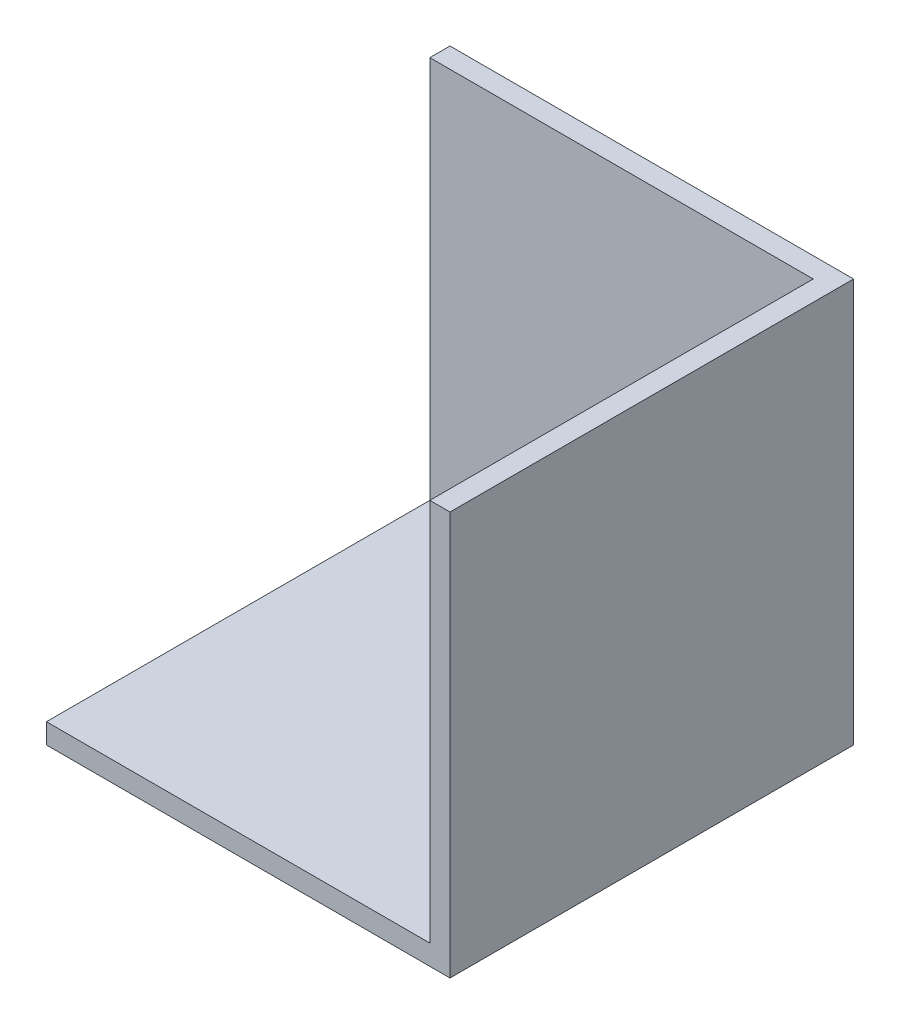
ISO-10303-21;
HEADER;
FILE_DESCRIPTION(('STEP AP214'),'2;1');
FILE_NAME('part.step','',(''),(''),'','','');
FILE_SCHEMA(('AUTOMOTIVE_DESIGN { 1 0 10303 214 1 1 1 1 }'));
ENDSEC;
DATA;
#1=APPLICATION_CONTEXT('core data for automotive mechanical design processes');
#2=APPLICATION_PROTOCOL_DEFINITION('international standard','automotive_design',2000,#1);
#3=PRODUCT_CONTEXT('',#1,'mechanical');
#4=PRODUCT('Part','Part','',(#3));
#5=PRODUCT_RELATED_PRODUCT_CATEGORY('part','',(#4));
#6=PRODUCT_DEFINITION_FORMATION('','',#4);
#7=PRODUCT_DEFINITION_CONTEXT('part definition',#1,'design');
#8=PRODUCT_DEFINITION('design','',#6,#7);
#9=PRODUCT_DEFINITION_SHAPE('','',#8);
#10=(LENGTH_UNIT() NAMED_UNIT(*) SI_UNIT(.MILLI.,.METRE.));
#11=(NAMED_UNIT(*) PLANE_ANGLE_UNIT() SI_UNIT($,.RADIAN.));
#12=(NAMED_UNIT(*) SI_UNIT($,.STERADIAN.) SOLID_ANGLE_UNIT());
#13=UNCERTAINTY_MEASURE_WITH_UNIT(LENGTH_MEASURE(1.E-05),#10,'distance_accuracy_value','');
#14=(GEOMETRIC_REPRESENTATION_CONTEXT(3) GLOBAL_UNCERTAINTY_ASSIGNED_CONTEXT((#13)) GLOBAL_UNIT_ASSIGNED_CONTEXT((#10,
#11,#12)) REPRESENTATION_CONTEXT('',''));
#15=CARTESIAN_POINT('',(0.,0.,0.));
#16=DIRECTION('',(0.,0.,1.));
#17=DIRECTION('',(1.,0.,0.));
#18=AXIS2_PLACEMENT_3D('',#15,#16,#17);
#19=CARTESIAN_POINT('',(0.,0.,5.));
#20=DIRECTION('',(0.,0.,-1.));
#21=DIRECTION('',(-1.,0.,0.));
#22=AXIS2_PLACEMENT_3D('',#19,#20,#21);
#23=PLANE('',#22);
#24=DIRECTION('',(-1.,0.,0.));
#25=VECTOR('',#24,1.);
#26=CARTESIAN_POINT('',(45.,-45.,5.));
#27=LINE('',#26,#25);
#28=CARTESIAN_POINT('',(45.,-45.,5.));
#29=VERTEX_POINT('',#28);
#30=CARTESIAN_POINT('',(-50.,-45.,5.));
#31=VERTEX_POINT('',#30);
#32=EDGE_CURVE('E254',#29,#31,#27,.T.);
#33=ORIENTED_EDGE('',*,*,#32,.F.);
#34=DIRECTION('',(0.,-1.,0.));
#35=VECTOR('',#34,1.);
#36=CARTESIAN_POINT('',(45.,50.,5.));
#37=LINE('',#36,#35);
#38=CARTESIAN_POINT('',(45.,50.,5.));
#39=VERTEX_POINT('',#38);
#40=EDGE_CURVE('E237',#39,#29,#37,.T.);
#41=ORIENTED_EDGE('',*,*,#40,.F.);
#42=DIRECTION('',(-1.,0.,0.));
#43=VECTOR('',#42,1.);
#44=CARTESIAN_POINT('',(-50.,50.,5.));
#45=LINE('',#44,#43);
#46=CARTESIAN_POINT('',(-50.,50.,5.));
#47=VERTEX_POINT('',#46);
#48=EDGE_CURVE('E291',#39,#47,#45,.T.);
#49=ORIENTED_EDGE('',*,*,#48,.T.);
#50=DIRECTION('',(0.,-1.,0.));
#51=VECTOR('',#50,1.);
#52=CARTESIAN_POINT('',(-50.,-50.,5.));
#53=LINE('',#52,#51);
#54=EDGE_CURVE('E294',#47,#31,#53,.T.);
#55=ORIENTED_EDGE('',*,*,#54,.T.);
#56=EDGE_LOOP('',(#33,#41,#49,#55));
#57=FACE_BOUND('',#56,.T.);
#58=ADVANCED_FACE('F43',(#57),#23,.F.);
#59=CARTESIAN_POINT('',(50.,-50.,5.));
#60=DIRECTION('',(-1.,0.,0.));
#61=DIRECTION('',(0.,0.,1.));
#62=AXIS2_PLACEMENT_3D('',#59,#60,#61);
#63=PLANE('',#62);
#64=DIRECTION('',(0.,1.,0.));
#65=VECTOR('',#64,1.);
#66=CARTESIAN_POINT('',(50.,-50.,0.));
#67=LINE('',#66,#65);
#68=CARTESIAN_POINT('',(50.,-50.,0.));
#69=VERTEX_POINT('',#68);
#70=CARTESIAN_POINT('',(50.,50.,0.));
#71=VERTEX_POINT('',#70);
#72=EDGE_CURVE('E290',#69,#71,#67,.T.);
#73=ORIENTED_EDGE('',*,*,#72,.T.);
#74=DIRECTION('',(0.,0.,-1.));
#75=VECTOR('',#74,1.);
#76=CARTESIAN_POINT('',(50.,50.,5.));
#77=LINE('',#76,#75);
#78=CARTESIAN_POINT('',(50.,50.,100.));
#79=VERTEX_POINT('',#78);
#80=EDGE_CURVE('E11',#79,#71,#77,.T.);
#81=ORIENTED_EDGE('',*,*,#80,.F.);
#82=DIRECTION('',(0.,1.,0.));
#83=VECTOR('',#82,1.);
#84=CARTESIAN_POINT('',(50.,50.,100.));
#85=LINE('',#84,#83);
#86=CARTESIAN_POINT('',(50.,-50.,100.));
#87=VERTEX_POINT('',#86);
#88=EDGE_CURVE('E268',#87,#79,#85,.T.);
#89=ORIENTED_EDGE('',*,*,#88,.F.);
#90=DIRECTION('',(0.,0.,-1.));
#91=VECTOR('',#90,1.);
#92=CARTESIAN_POINT('',(50.,-50.,5.));
#93=LINE('',#92,#91);
#94=EDGE_CURVE('E298',#87,#69,#93,.T.);
#95=ORIENTED_EDGE('',*,*,#94,.T.);
#96=EDGE_LOOP('',(#73,#81,#89,#95));
#97=FACE_BOUND('',#96,.T.);
#98=ADVANCED_FACE('F45',(#97),#63,.F.);
#99=CARTESIAN_POINT('',(-50.,50.,5.));
#100=DIRECTION('',(0.,-1.,0.));
#101=DIRECTION('',(0.,0.,-1.));
#102=AXIS2_PLACEMENT_3D('',#99,#100,#101);
#103=PLANE('',#102);
#104=DIRECTION('',(-1.,0.,0.));
#105=VECTOR('',#104,1.);
#106=CARTESIAN_POINT('',(-50.,50.,0.));
#107=LINE('',#106,#105);
#108=CARTESIAN_POINT('',(-50.,50.,0.));
#109=VERTEX_POINT('',#108);
#110=EDGE_CURVE('E302',#71,#109,#107,.T.);
#111=ORIENTED_EDGE('',*,*,#110,.T.);
#112=DIRECTION('',(0.,0.,-1.));
#113=VECTOR('',#112,1.);
#114=CARTESIAN_POINT('',(-50.,50.,5.));
#115=LINE('',#114,#113);
#116=EDGE_CURVE('E53',#47,#109,#115,.T.);
#117=ORIENTED_EDGE('',*,*,#116,.F.);
#118=ORIENTED_EDGE('',*,*,#48,.F.);
#119=DIRECTION('',(0.,0.,-1.));
#120=VECTOR('',#119,1.);
#121=CARTESIAN_POINT('',(45.,50.,100.));
#122=LINE('',#121,#120);
#123=CARTESIAN_POINT('',(45.,50.,100.));
#124=VERTEX_POINT('',#123);
#125=EDGE_CURVE('E286',#124,#39,#122,.T.);
#126=ORIENTED_EDGE('',*,*,#125,.F.);
#127=DIRECTION('',(-1.,0.,0.));
#128=VECTOR('',#127,1.);
#129=CARTESIAN_POINT('',(45.,50.,100.));
#130=LINE('',#129,#128);
#131=EDGE_CURVE('E249',#79,#124,#130,.T.);
#132=ORIENTED_EDGE('',*,*,#131,.F.);
#133=ORIENTED_EDGE('',*,*,#80,.T.);
#134=EDGE_LOOP('',(#111,#117,#118,#126,#132,#133));
#135=FACE_BOUND('',#134,.T.);
#136=ADVANCED_FACE('F374',(#135),#103,.F.);
#137=CARTESIAN_POINT('',(-50.,-50.,5.));
#138=DIRECTION('',(1.,0.,0.));
#139=DIRECTION('',(0.,0.,-1.));
#140=AXIS2_PLACEMENT_3D('',#137,#138,#139);
#141=PLANE('',#140);
#142=DIRECTION('',(0.,-1.,0.));
#143=VECTOR('',#142,1.);
#144=CARTESIAN_POINT('',(-50.,-50.,0.));
#145=LINE('',#144,#143);
#146=CARTESIAN_POINT('',(-50.,-50.,0.));
#147=VERTEX_POINT('',#146);
#148=EDGE_CURVE('E305',#109,#147,#145,.T.);
#149=ORIENTED_EDGE('',*,*,#148,.T.);
#150=DIRECTION('',(0.,0.,-1.));
#151=VECTOR('',#150,1.);
#152=CARTESIAN_POINT('',(-50.,-50.,5.));
#153=LINE('',#152,#151);
#154=CARTESIAN_POINT('',(-50.,-50.,100.));
#155=VERTEX_POINT('',#154);
#156=EDGE_CURVE('E313',#155,#147,#153,.T.);
#157=ORIENTED_EDGE('',*,*,#156,.F.);
#158=DIRECTION('',(0.,-1.,0.));
#159=VECTOR('',#158,1.);
#160=CARTESIAN_POINT('',(-50.,-45.,100.));
#161=LINE('',#160,#159);
#162=CARTESIAN_POINT('',(-50.,-45.,100.));
#163=VERTEX_POINT('',#162);
#164=EDGE_CURVE('E260',#163,#155,#161,.T.);
#165=ORIENTED_EDGE('',*,*,#164,.F.);
#166=DIRECTION('',(0.,0.,-1.));
#167=VECTOR('',#166,1.);
#168=CARTESIAN_POINT('',(-50.,-45.,100.));
#169=LINE('',#168,#167);
#170=EDGE_CURVE('E272',#163,#31,#169,.T.);
#171=ORIENTED_EDGE('',*,*,#170,.T.);
#172=ORIENTED_EDGE('',*,*,#54,.F.);
#173=ORIENTED_EDGE('',*,*,#116,.T.);
#174=EDGE_LOOP('',(#149,#157,#165,#171,#172,#173));
#175=FACE_BOUND('',#174,.T.);
#176=ADVANCED_FACE('F386',(#175),#141,.F.);
#177=CARTESIAN_POINT('',(-50.,-50.,5.));
#178=DIRECTION('',(0.,1.,0.));
#179=DIRECTION('',(0.,0.,1.));
#180=AXIS2_PLACEMENT_3D('',#177,#178,#179);
#181=PLANE('',#180);
#182=DIRECTION('',(1.,0.,0.));
#183=VECTOR('',#182,1.);
#184=CARTESIAN_POINT('',(-50.,-50.,0.));
#185=LINE('',#184,#183);
#186=EDGE_CURVE('E295',#147,#69,#185,.T.);
#187=ORIENTED_EDGE('',*,*,#186,.T.);
#188=ORIENTED_EDGE('',*,*,#94,.F.);
#189=DIRECTION('',(1.,0.,0.));
#190=VECTOR('',#189,1.);
#191=CARTESIAN_POINT('',(50.,-50.,100.));
#192=LINE('',#191,#190);
#193=EDGE_CURVE('E264',#155,#87,#192,.T.);
#194=ORIENTED_EDGE('',*,*,#193,.F.);
#195=ORIENTED_EDGE('',*,*,#156,.T.);
#196=EDGE_LOOP('',(#187,#188,#194,#195));
#197=FACE_BOUND('',#196,.T.);
#198=ADVANCED_FACE('F382',(#197),#181,.F.);
#199=CARTESIAN_POINT('',(0.,0.,0.));
#200=DIRECTION('',(0.,0.,-1.));
#201=DIRECTION('',(-1.,0.,0.));
#202=AXIS2_PLACEMENT_3D('',#199,#200,#201);
#203=PLANE('',#202);
#204=ORIENTED_EDGE('',*,*,#72,.F.);
#205=ORIENTED_EDGE('',*,*,#186,.F.);
#206=ORIENTED_EDGE('',*,*,#148,.F.);
#207=ORIENTED_EDGE('',*,*,#110,.F.);
#208=EDGE_LOOP('',(#204,#205,#206,#207));
#209=FACE_BOUND('',#208,.T.);
#210=ADVANCED_FACE('F379',(#209),#203,.T.);
#211=CARTESIAN_POINT('',(45.,50.,100.));
#212=DIRECTION('',(1.,0.,0.));
#213=DIRECTION('',(0.,1.,0.));
#214=AXIS2_PLACEMENT_3D('',#211,#212,#213);
#215=PLANE('',#214);
#216=DIRECTION('',(0.,1.,0.));
#217=VECTOR('',#216,1.);
#218=CARTESIAN_POINT('',(45.,2.,42.));
#219=LINE('',#218,#217);
#220=CARTESIAN_POINT('',(45.,1.99999999999999,42.));
#221=VERTEX_POINT('',#220);
#222=CARTESIAN_POINT('',(45.,18.,42.));
#223=VERTEX_POINT('',#222);
#224=EDGE_CURVE('E69',#221,#223,#219,.T.);
#225=ORIENTED_EDGE('',*,*,#224,.T.);
#226=DIRECTION('',(0.,0.,1.));
#227=VECTOR('',#226,1.);
#228=CARTESIAN_POINT('',(45.,18.,42.));
#229=LINE('',#228,#227);
#230=CARTESIAN_POINT('',(45.,18.,58.));
#231=VERTEX_POINT('',#230);
#232=EDGE_CURVE('E201',#223,#231,#229,.T.);
#233=ORIENTED_EDGE('',*,*,#232,.T.);
#234=DIRECTION('',(0.,1.,0.));
#235=VECTOR('',#234,1.);
#236=CARTESIAN_POINT('',(45.,2.,58.));
#237=LINE('',#236,#235);
#238=CARTESIAN_POINT('',(45.,1.99999999999999,58.));
#239=VERTEX_POINT('',#238);
#240=EDGE_CURVE('E224',#239,#231,#237,.T.);
#241=ORIENTED_EDGE('',*,*,#240,.F.);
#242=DIRECTION('',(0.,0.,1.));
#243=VECTOR('',#242,1.);
#244=CARTESIAN_POINT('',(45.,2.,42.));
#245=LINE('',#244,#243);
#246=EDGE_CURVE('E228',#221,#239,#245,.T.);
#247=ORIENTED_EDGE('',*,*,#246,.F.);
#248=EDGE_LOOP('',(#225,#233,#241,#247));
#249=FACE_BOUND('',#248,.T.);
#250=ORIENTED_EDGE('',*,*,#40,.T.);
#251=DIRECTION('',(0.,0.,-1.));
#252=VECTOR('',#251,1.);
#253=CARTESIAN_POINT('',(45.,-45.,100.));
#254=LINE('',#253,#252);
#255=CARTESIAN_POINT('',(45.,-45.,100.));
#256=VERTEX_POINT('',#255);
#257=EDGE_CURVE('E282',#256,#29,#254,.T.);
#258=ORIENTED_EDGE('',*,*,#257,.F.);
#259=DIRECTION('',(0.,-1.,0.));
#260=VECTOR('',#259,1.);
#261=CARTESIAN_POINT('',(45.,50.,100.));
#262=LINE('',#261,#260);
#263=EDGE_CURVE('E253',#124,#256,#262,.T.);
#264=ORIENTED_EDGE('',*,*,#263,.F.);
#265=ORIENTED_EDGE('',*,*,#125,.T.);
#266=EDGE_LOOP('',(#250,#258,#264,#265));
#267=FACE_BOUND('',#266,.T.);
#268=ADVANCED_FACE('F348',(#249,#267),#215,.F.);
#269=CARTESIAN_POINT('',(45.,-45.,100.));
#270=DIRECTION('',(0.,-1.,0.));
#271=DIRECTION('',(1.,0.,0.));
#272=AXIS2_PLACEMENT_3D('',#269,#270,#271);
#273=PLANE('',#272);
#274=ORIENTED_EDGE('',*,*,#32,.T.);
#275=ORIENTED_EDGE('',*,*,#170,.F.);
#276=DIRECTION('',(-1.,0.,0.));
#277=VECTOR('',#276,1.);
#278=CARTESIAN_POINT('',(45.,-45.,100.));
#279=LINE('',#278,#277);
#280=EDGE_CURVE('E257',#256,#163,#279,.T.);
#281=ORIENTED_EDGE('',*,*,#280,.F.);
#282=ORIENTED_EDGE('',*,*,#257,.T.);
#283=EDGE_LOOP('',(#274,#275,#281,#282));
#284=FACE_BOUND('',#283,.T.);
#285=ADVANCED_FACE('F410',(#284),#273,.F.);
#286=CARTESIAN_POINT('',(0.,0.,100.));
#287=DIRECTION('',(0.,0.,-1.));
#288=DIRECTION('',(-1.,0.,0.));
#289=AXIS2_PLACEMENT_3D('',#286,#287,#288);
#290=PLANE('',#289);
#291=ORIENTED_EDGE('',*,*,#131,.T.);
#292=ORIENTED_EDGE('',*,*,#263,.T.);
#293=ORIENTED_EDGE('',*,*,#280,.T.);
#294=ORIENTED_EDGE('',*,*,#164,.T.);
#295=ORIENTED_EDGE('',*,*,#193,.T.);
#296=ORIENTED_EDGE('',*,*,#88,.T.);
#297=EDGE_LOOP('',(#291,#292,#293,#294,#295,#296));
#298=FACE_BOUND('',#297,.T.);
#299=ADVANCED_FACE('F342',(#298),#290,.F.);
#300=CARTESIAN_POINT('',(25.,18.,42.));
#301=DIRECTION('',(0.,1.,0.));
#302=DIRECTION('',(-1.,0.,0.));
#303=AXIS2_PLACEMENT_3D('',#300,#301,#302);
#304=PLANE('',#303);
#305=CARTESIAN_POINT('',(39.3,18.,49.8164021553474));
#306=DIRECTION('',(0.,1.,0.));
#307=DIRECTION('',(-1.,0.,0.));
#308=AXIS2_PLACEMENT_3D('',#305,#306,#307);
#309=CIRCLE('',#308,2.);
#310=CARTESIAN_POINT('',(37.3,18.,49.8164021553474));
#311=VERTEX_POINT('',#310);
#312=EDGE_CURVE('E322',#311,#311,#309,.T.);
#313=ORIENTED_EDGE('',*,*,#312,.F.);
#314=EDGE_LOOP('',(#313));
#315=FACE_BOUND('',#314,.T.);
#316=CARTESIAN_POINT('',(29.3,18.,49.8164021553474));
#317=DIRECTION('',(0.,1.,0.));
#318=DIRECTION('',(-1.,0.,0.));
#319=AXIS2_PLACEMENT_3D('',#316,#317,#318);
#320=CIRCLE('',#319,2.);
#321=CARTESIAN_POINT('',(27.3,18.,49.8164021553474));
#322=VERTEX_POINT('',#321);
#323=EDGE_CURVE('E183',#322,#322,#320,.T.);
#324=ORIENTED_EDGE('',*,*,#323,.F.);
#325=EDGE_LOOP('',(#324));
#326=FACE_BOUND('',#325,.T.);
#327=ORIENTED_EDGE('',*,*,#232,.F.);
#328=DIRECTION('',(1.,0.,0.));
#329=VECTOR('',#328,1.);
#330=CARTESIAN_POINT('',(25.,18.,42.));
#331=LINE('',#330,#329);
#332=CARTESIAN_POINT('',(25.,18.,42.));
#333=VERTEX_POINT('',#332);
#334=EDGE_CURVE('E234',#333,#223,#331,.T.);
#335=ORIENTED_EDGE('',*,*,#334,.F.);
#336=DIRECTION('',(0.,0.,1.));
#337=VECTOR('',#336,1.);
#338=CARTESIAN_POINT('',(25.,18.,42.));
#339=LINE('',#338,#337);
#340=CARTESIAN_POINT('',(25.,18.,58.));
#341=VERTEX_POINT('',#340);
#342=EDGE_CURVE('E207',#333,#341,#339,.T.);
#343=ORIENTED_EDGE('',*,*,#342,.T.);
#344=DIRECTION('',(1.,0.,0.));
#345=VECTOR('',#344,1.);
#346=CARTESIAN_POINT('',(25.,18.,58.));
#347=LINE('',#346,#345);
#348=EDGE_CURVE('E221',#341,#231,#347,.T.);
#349=ORIENTED_EDGE('',*,*,#348,.T.);
#350=EDGE_LOOP('',(#327,#335,#343,#349));
#351=FACE_BOUND('',#350,.T.);
#352=ADVANCED_FACE('F338',(#315,#326,#351),#304,.T.);
#353=CARTESIAN_POINT('',(25.,1.99999999999999,42.));
#354=DIRECTION('',(0.,0.,-1.));
#355=DIRECTION('',(-1.,0.,0.));
#356=AXIS2_PLACEMENT_3D('',#353,#354,#355);
#357=PLANE('',#356);
#358=ORIENTED_EDGE('',*,*,#224,.F.);
#359=DIRECTION('',(1.,0.,0.));
#360=VECTOR('',#359,1.);
#361=CARTESIAN_POINT('',(25.,1.99999999999999,42.));
#362=LINE('',#361,#360);
#363=CARTESIAN_POINT('',(25.,1.99999999999999,42.));
#364=VERTEX_POINT('',#363);
#365=EDGE_CURVE('E238',#364,#221,#362,.T.);
#366=ORIENTED_EDGE('',*,*,#365,.F.);
#367=DIRECTION('',(0.,1.,0.));
#368=VECTOR('',#367,1.);
#369=CARTESIAN_POINT('',(25.,1.99999999999999,42.));
#370=LINE('',#369,#368);
#371=EDGE_CURVE('E217',#364,#333,#370,.T.);
#372=ORIENTED_EDGE('',*,*,#371,.T.);
#373=ORIENTED_EDGE('',*,*,#334,.T.);
#374=EDGE_LOOP('',(#358,#366,#372,#373));
#375=FACE_BOUND('',#374,.T.);
#376=ADVANCED_FACE('F341',(#375),#357,.T.);
#377=CARTESIAN_POINT('',(25.,1.99999999999999,42.));
#378=DIRECTION('',(0.,1.,0.));
#379=DIRECTION('',(-1.,0.,0.));
#380=AXIS2_PLACEMENT_3D('',#377,#378,#379);
#381=PLANE('',#380);
#382=ORIENTED_EDGE('',*,*,#246,.T.);
#383=DIRECTION('',(1.,0.,0.));
#384=VECTOR('',#383,1.);
#385=CARTESIAN_POINT('',(25.,1.99999999999999,58.));
#386=LINE('',#385,#384);
#387=CARTESIAN_POINT('',(25.,1.99999999999999,58.));
#388=VERTEX_POINT('',#387);
#389=EDGE_CURVE('E242',#388,#239,#386,.T.);
#390=ORIENTED_EDGE('',*,*,#389,.F.);
#391=DIRECTION('',(0.,0.,1.));
#392=VECTOR('',#391,1.);
#393=CARTESIAN_POINT('',(25.,1.99999999999999,42.));
#394=LINE('',#393,#392);
#395=EDGE_CURVE('E214',#364,#388,#394,.T.);
#396=ORIENTED_EDGE('',*,*,#395,.F.);
#397=ORIENTED_EDGE('',*,*,#365,.T.);
#398=EDGE_LOOP('',(#382,#390,#396,#397));
#399=FACE_BOUND('',#398,.T.);
#400=ADVANCED_FACE('F353',(#399),#381,.F.);
#401=CARTESIAN_POINT('',(25.,1.99999999999999,58.));
#402=DIRECTION('',(0.,0.,-1.));
#403=DIRECTION('',(-1.,0.,0.));
#404=AXIS2_PLACEMENT_3D('',#401,#402,#403);
#405=PLANE('',#404);
#406=ORIENTED_EDGE('',*,*,#240,.T.);
#407=ORIENTED_EDGE('',*,*,#348,.F.);
#408=DIRECTION('',(0.,1.,0.));
#409=VECTOR('',#408,1.);
#410=CARTESIAN_POINT('',(25.,1.99999999999999,58.));
#411=LINE('',#410,#409);
#412=EDGE_CURVE('E211',#388,#341,#411,.T.);
#413=ORIENTED_EDGE('',*,*,#412,.F.);
#414=ORIENTED_EDGE('',*,*,#389,.T.);
#415=EDGE_LOOP('',(#406,#407,#413,#414));
#416=FACE_BOUND('',#415,.T.);
#417=ADVANCED_FACE('F356',(#416),#405,.F.);
#418=CARTESIAN_POINT('',(25.,0.,0.));
#419=DIRECTION('',(-1.,0.,0.));
#420=DIRECTION('',(0.,0.,1.));
#421=AXIS2_PLACEMENT_3D('',#418,#419,#420);
#422=PLANE('',#421);
#423=DIRECTION('',(0.,1.,0.));
#424=VECTOR('',#423,1.);
#425=CARTESIAN_POINT('',(25.,3.5,56.5));
#426=LINE('',#425,#424);
#427=CARTESIAN_POINT('',(25.,3.5,56.5));
#428=VERTEX_POINT('',#427);
#429=CARTESIAN_POINT('',(25.,16.5,56.5));
#430=VERTEX_POINT('',#429);
#431=EDGE_CURVE('E61',#428,#430,#426,.T.);
#432=ORIENTED_EDGE('',*,*,#431,.F.);
#433=DIRECTION('',(0.,0.,1.));
#434=VECTOR('',#433,1.);
#435=CARTESIAN_POINT('',(25.,3.5,43.5));
#436=LINE('',#435,#434);
#437=CARTESIAN_POINT('',(25.,3.5,43.5));
#438=VERTEX_POINT('',#437);
#439=EDGE_CURVE('E176',#438,#428,#436,.T.);
#440=ORIENTED_EDGE('',*,*,#439,.F.);
#441=DIRECTION('',(0.,-1.,0.));
#442=VECTOR('',#441,1.);
#443=CARTESIAN_POINT('',(25.,3.5,43.5));
#444=LINE('',#443,#442);
#445=CARTESIAN_POINT('',(25.,16.5,43.5));
#446=VERTEX_POINT('',#445);
#447=EDGE_CURVE('E180',#446,#438,#444,.T.);
#448=ORIENTED_EDGE('',*,*,#447,.F.);
#449=DIRECTION('',(0.,0.,-1.));
#450=VECTOR('',#449,1.);
#451=CARTESIAN_POINT('',(25.,16.5,43.5));
#452=LINE('',#451,#450);
#453=EDGE_CURVE('E192',#430,#446,#452,.T.);
#454=ORIENTED_EDGE('',*,*,#453,.F.);
#455=EDGE_LOOP('',(#432,#440,#448,#454));
#456=FACE_BOUND('',#455,.T.);
#457=ORIENTED_EDGE('',*,*,#342,.F.);
#458=ORIENTED_EDGE('',*,*,#371,.F.);
#459=ORIENTED_EDGE('',*,*,#395,.T.);
#460=ORIENTED_EDGE('',*,*,#412,.T.);
#461=EDGE_LOOP('',(#457,#458,#459,#460));
#462=FACE_BOUND('',#461,.T.);
#463=ADVANCED_FACE('F358',(#456,#462),#422,.T.);
#464=CARTESIAN_POINT('',(45.,3.5,56.5));
#465=DIRECTION('',(0.,0.,1.));
#466=DIRECTION('',(1.,0.,0.));
#467=AXIS2_PLACEMENT_3D('',#464,#465,#466);
#468=PLANE('',#467);
#469=ORIENTED_EDGE('',*,*,#431,.T.);
#470=DIRECTION('',(-1.,0.,0.));
#471=VECTOR('',#470,1.);
#472=CARTESIAN_POINT('',(45.,16.5,56.5));
#473=LINE('',#472,#471);
#474=CARTESIAN_POINT('',(45.,16.5,56.5));
#475=VERTEX_POINT('',#474);
#476=EDGE_CURVE('E151',#475,#430,#473,.T.);
#477=ORIENTED_EDGE('',*,*,#476,.F.);
#478=DIRECTION('',(0.,1.,0.));
#479=VECTOR('',#478,1.);
#480=CARTESIAN_POINT('',(45.,3.5,56.5));
#481=LINE('',#480,#479);
#482=CARTESIAN_POINT('',(45.,3.5,56.5));
#483=VERTEX_POINT('',#482);
#484=EDGE_CURVE('E155',#483,#475,#481,.T.);
#485=ORIENTED_EDGE('',*,*,#484,.F.);
#486=DIRECTION('',(-1.,0.,0.));
#487=VECTOR('',#486,1.);
#488=CARTESIAN_POINT('',(45.,3.5,56.5));
#489=LINE('',#488,#487);
#490=EDGE_CURVE('E198',#483,#428,#489,.T.);
#491=ORIENTED_EDGE('',*,*,#490,.T.);
#492=EDGE_LOOP('',(#469,#477,#485,#491));
#493=FACE_BOUND('',#492,.T.);
#494=ADVANCED_FACE('F153',(#493),#468,.F.);
#495=CARTESIAN_POINT('',(45.,3.5,43.5));
#496=DIRECTION('',(0.,-1.,0.));
#497=DIRECTION('',(0.,0.,-1.));
#498=AXIS2_PLACEMENT_3D('',#495,#496,#497);
#499=PLANE('',#498);
#500=ORIENTED_EDGE('',*,*,#439,.T.);
#501=ORIENTED_EDGE('',*,*,#490,.F.);
#502=DIRECTION('',(0.,0.,1.));
#503=VECTOR('',#502,1.);
#504=CARTESIAN_POINT('',(45.,3.5,43.5));
#505=LINE('',#504,#503);
#506=CARTESIAN_POINT('',(45.,3.5,43.5));
#507=VERTEX_POINT('',#506);
#508=EDGE_CURVE('E162',#507,#483,#505,.T.);
#509=ORIENTED_EDGE('',*,*,#508,.F.);
#510=DIRECTION('',(-1.,0.,0.));
#511=VECTOR('',#510,1.);
#512=CARTESIAN_POINT('',(45.,3.5,43.5));
#513=LINE('',#512,#511);
#514=EDGE_CURVE('E202',#507,#438,#513,.T.);
#515=ORIENTED_EDGE('',*,*,#514,.T.);
#516=EDGE_LOOP('',(#500,#501,#509,#515));
#517=FACE_BOUND('',#516,.T.);
#518=ADVANCED_FACE('F426',(#517),#499,.F.);
#519=CARTESIAN_POINT('',(45.,3.5,43.5));
#520=DIRECTION('',(0.,0.,-1.));
#521=DIRECTION('',(-1.,0.,0.));
#522=AXIS2_PLACEMENT_3D('',#519,#520,#521);
#523=PLANE('',#522);
#524=ORIENTED_EDGE('',*,*,#447,.T.);
#525=ORIENTED_EDGE('',*,*,#514,.F.);
#526=DIRECTION('',(0.,-1.,0.));
#527=VECTOR('',#526,1.);
#528=CARTESIAN_POINT('',(45.,3.5,43.5));
#529=LINE('',#528,#527);
#530=CARTESIAN_POINT('',(45.,16.5,43.5));
#531=VERTEX_POINT('',#530);
#532=EDGE_CURVE('E171',#531,#507,#529,.T.);
#533=ORIENTED_EDGE('',*,*,#532,.F.);
#534=DIRECTION('',(-1.,0.,0.));
#535=VECTOR('',#534,1.);
#536=CARTESIAN_POINT('',(45.,16.5,43.5));
#537=LINE('',#536,#535);
#538=EDGE_CURVE('E161',#531,#446,#537,.T.);
#539=ORIENTED_EDGE('',*,*,#538,.T.);
#540=EDGE_LOOP('',(#524,#525,#533,#539));
#541=FACE_BOUND('',#540,.T.);
#542=ADVANCED_FACE('F431',(#541),#523,.F.);
#543=CARTESIAN_POINT('',(45.,16.5,43.5));
#544=DIRECTION('',(0.,1.,0.));
#545=DIRECTION('',(0.,0.,1.));
#546=AXIS2_PLACEMENT_3D('',#543,#544,#545);
#547=PLANE('',#546);
#548=CARTESIAN_POINT('',(39.3,16.5,49.8164021553474));
#549=DIRECTION('',(0.,1.,0.));
#550=DIRECTION('',(0.,0.,1.));
#551=AXIS2_PLACEMENT_3D('',#548,#549,#550);
#552=CIRCLE('',#551,2.);
#553=CARTESIAN_POINT('',(39.3,16.5,51.8164021553474));
#554=VERTEX_POINT('',#553);
#555=EDGE_CURVE('E47',#554,#554,#552,.T.);
#556=ORIENTED_EDGE('',*,*,#555,.T.);
#557=EDGE_LOOP('',(#556));
#558=FACE_BOUND('',#557,.T.);
#559=CARTESIAN_POINT('',(29.3,16.5,49.8164021553474));
#560=DIRECTION('',(0.,1.,0.));
#561=DIRECTION('',(0.,0.,1.));
#562=AXIS2_PLACEMENT_3D('',#559,#560,#561);
#563=CIRCLE('',#562,2.);
#564=CARTESIAN_POINT('',(29.3,16.5,51.8164021553474));
#565=VERTEX_POINT('',#564);
#566=EDGE_CURVE('E319',#565,#565,#563,.T.);
#567=ORIENTED_EDGE('',*,*,#566,.T.);
#568=EDGE_LOOP('',(#567));
#569=FACE_BOUND('',#568,.T.);
#570=ORIENTED_EDGE('',*,*,#453,.T.);
#571=ORIENTED_EDGE('',*,*,#538,.F.);
#572=DIRECTION('',(0.,0.,-1.));
#573=VECTOR('',#572,1.);
#574=CARTESIAN_POINT('',(45.,16.5,43.5));
#575=LINE('',#574,#573);
#576=EDGE_CURVE('E165',#475,#531,#575,.T.);
#577=ORIENTED_EDGE('',*,*,#576,.F.);
#578=ORIENTED_EDGE('',*,*,#476,.T.);
#579=EDGE_LOOP('',(#570,#571,#577,#578));
#580=FACE_BOUND('',#579,.T.);
#581=ADVANCED_FACE('F166',(#558,#569,#580),#547,.F.);
#582=CARTESIAN_POINT('',(45.,0.,0.));
#583=DIRECTION('',(1.,0.,0.));
#584=DIRECTION('',(0.,0.,-1.));
#585=AXIS2_PLACEMENT_3D('',#582,#583,#584);
#586=PLANE('',#585);
#587=ORIENTED_EDGE('',*,*,#484,.T.);
#588=ORIENTED_EDGE('',*,*,#576,.T.);
#589=ORIENTED_EDGE('',*,*,#532,.T.);
#590=ORIENTED_EDGE('',*,*,#508,.T.);
#591=EDGE_LOOP('',(#587,#588,#589,#590));
#592=FACE_BOUND('',#591,.T.);
#593=ADVANCED_FACE('F173',(#592),#586,.F.);
#594=CARTESIAN_POINT('',(29.3,13.,49.8164021553474));
#595=DIRECTION('',(0.,1.,0.));
#596=DIRECTION('',(-1.,0.,0.));
#597=AXIS2_PLACEMENT_3D('',#594,#595,#596);
#598=CYLINDRICAL_SURFACE('',#597,2.);
#599=ORIENTED_EDGE('',*,*,#323,.T.);
#600=EDGE_LOOP('',(#599));
#601=FACE_BOUND('',#600,.T.);
#602=ORIENTED_EDGE('',*,*,#566,.F.);
#603=EDGE_LOOP('',(#602));
#604=FACE_BOUND('',#603,.T.);
#605=ADVANCED_FACE('F335',(#601,#604),#598,.F.);
#606=CARTESIAN_POINT('',(39.3,13.,49.8164021553474));
#607=DIRECTION('',(0.,1.,0.));
#608=DIRECTION('',(-1.,0.,0.));
#609=AXIS2_PLACEMENT_3D('',#606,#607,#608);
#610=CYLINDRICAL_SURFACE('',#609,2.);
#611=ORIENTED_EDGE('',*,*,#312,.T.);
#612=EDGE_LOOP('',(#611));
#613=FACE_BOUND('',#612,.T.);
#614=ORIENTED_EDGE('',*,*,#555,.F.);
#615=EDGE_LOOP('',(#614));
#616=FACE_BOUND('',#615,.T.);
#617=ADVANCED_FACE('F443',(#613,#616),#610,.F.);
#618=CLOSED_SHELL('',(#58,#98,#136,#176,#198,#210,#268,#285,#299,#352,#376,#400,#417,#463,#494,
#518,#542,#581,#593,#605,#617));
#619=MANIFOLD_SOLID_BREP('B2',#618);
#620=ADVANCED_BREP_SHAPE_REPRESENTATION('',(#18,#619),#14);
#621=SHAPE_DEFINITION_REPRESENTATION(#9,#620);
ENDSEC;
END-ISO-10303-21;
